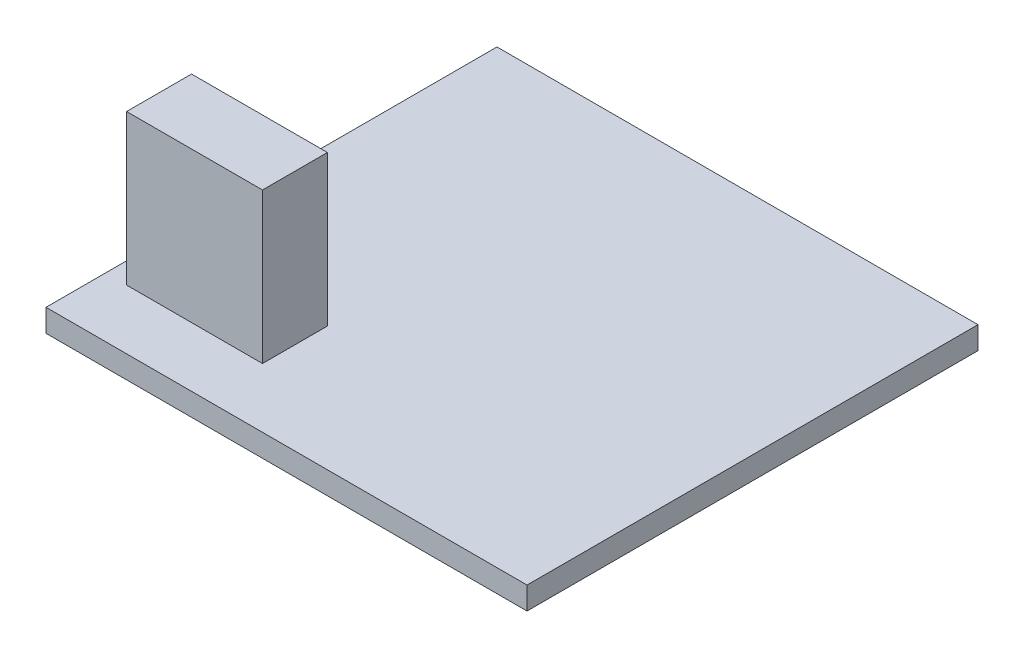
ISO-10303-21;
HEADER;
FILE_DESCRIPTION(('STEP AP214'),'2;1');
FILE_NAME('part.step','',(''),(''),'','','');
FILE_SCHEMA(('AUTOMOTIVE_DESIGN { 1 0 10303 214 1 1 1 1 }'));
ENDSEC;
DATA;
#1=APPLICATION_CONTEXT('core data for automotive mechanical design processes');
#2=APPLICATION_PROTOCOL_DEFINITION('international standard','automotive_design',2000,#1);
#3=PRODUCT_CONTEXT('',#1,'mechanical');
#4=PRODUCT('Part','Part','',(#3));
#5=PRODUCT_RELATED_PRODUCT_CATEGORY('part','',(#4));
#6=PRODUCT_DEFINITION_FORMATION('','',#4);
#7=PRODUCT_DEFINITION_CONTEXT('part definition',#1,'design');
#8=PRODUCT_DEFINITION('design','',#6,#7);
#9=PRODUCT_DEFINITION_SHAPE('','',#8);
#10=(LENGTH_UNIT() NAMED_UNIT(*) SI_UNIT(.MILLI.,.METRE.));
#11=(NAMED_UNIT(*) PLANE_ANGLE_UNIT() SI_UNIT($,.RADIAN.));
#12=(NAMED_UNIT(*) SI_UNIT($,.STERADIAN.) SOLID_ANGLE_UNIT());
#13=UNCERTAINTY_MEASURE_WITH_UNIT(LENGTH_MEASURE(1.E-05),#10,'distance_accuracy_value','');
#14=(GEOMETRIC_REPRESENTATION_CONTEXT(3) GLOBAL_UNCERTAINTY_ASSIGNED_CONTEXT((#13)) GLOBAL_UNIT_ASSIGNED_CONTEXT((#10,
#11,#12)) REPRESENTATION_CONTEXT('',''));
#15=CARTESIAN_POINT('',(0.,0.,0.));
#16=DIRECTION('',(0.,0.,1.));
#17=DIRECTION('',(1.,0.,0.));
#18=AXIS2_PLACEMENT_3D('',#15,#16,#17);
#19=CARTESIAN_POINT('',(0.,1.5,0.));
#20=DIRECTION('',(0.,-1.,0.));
#21=DIRECTION('',(0.,0.,-1.));
#22=AXIS2_PLACEMENT_3D('',#19,#20,#21);
#23=PLANE('',#22);
#24=DIRECTION('',(0.,0.,-1.));
#25=VECTOR('',#24,1.);
#26=CARTESIAN_POINT('',(16.,1.5,15.));
#27=LINE('',#26,#25);
#28=CARTESIAN_POINT('',(16.,1.5,15.));
#29=VERTEX_POINT('',#28);
#30=CARTESIAN_POINT('',(16.,1.5,-15.));
#31=VERTEX_POINT('',#30);
#32=EDGE_CURVE('E138',#29,#31,#27,.T.);
#33=ORIENTED_EDGE('',*,*,#32,.T.);
#34=DIRECTION('',(-1.,0.,0.));
#35=VECTOR('',#34,1.);
#36=CARTESIAN_POINT('',(-16.,1.5,-15.));
#37=LINE('',#36,#35);
#38=CARTESIAN_POINT('',(-16.,1.5,-15.));
#39=VERTEX_POINT('',#38);
#40=EDGE_CURVE('E141',#31,#39,#37,.T.);
#41=ORIENTED_EDGE('',*,*,#40,.T.);
#42=DIRECTION('',(0.,0.,1.));
#43=VECTOR('',#42,1.);
#44=CARTESIAN_POINT('',(-16.,1.5,15.));
#45=LINE('',#44,#43);
#46=CARTESIAN_POINT('',(-16.,1.5,15.));
#47=VERTEX_POINT('',#46);
#48=EDGE_CURVE('E144',#39,#47,#45,.T.);
#49=ORIENTED_EDGE('',*,*,#48,.T.);
#50=DIRECTION('',(1.,0.,0.));
#51=VECTOR('',#50,1.);
#52=CARTESIAN_POINT('',(-16.,1.5,15.));
#53=LINE('',#52,#51);
#54=EDGE_CURVE('E146',#47,#29,#53,.T.);
#55=ORIENTED_EDGE('',*,*,#54,.T.);
#56=EDGE_LOOP('',(#33,#41,#49,#55));
#57=FACE_BOUND('',#56,.T.);
#58=DIRECTION('',(1.,0.,0.));
#59=VECTOR('',#58,1.);
#60=CARTESIAN_POINT('',(-14.5989415767357,1.5,11.0391996580248));
#61=LINE('',#60,#59);
#62=CARTESIAN_POINT('',(-14.5989415767357,1.5,11.0391996580248));
#63=VERTEX_POINT('',#62);
#64=CARTESIAN_POINT('',(-5.55959692922263,1.5,11.0391996580248));
#65=VERTEX_POINT('',#64);
#66=EDGE_CURVE('E116',#63,#65,#61,.T.);
#67=ORIENTED_EDGE('',*,*,#66,.F.);
#68=DIRECTION('',(0.,0.,1.));
#69=VECTOR('',#68,1.);
#70=CARTESIAN_POINT('',(-14.5989415767357,1.5,6.71951283531943));
#71=LINE('',#70,#69);
#72=CARTESIAN_POINT('',(-14.5989415767357,1.5,6.71951283531943));
#73=VERTEX_POINT('',#72);
#74=EDGE_CURVE('E111',#73,#63,#71,.T.);
#75=ORIENTED_EDGE('',*,*,#74,.F.);
#76=DIRECTION('',(1.,0.,0.));
#77=VECTOR('',#76,1.);
#78=CARTESIAN_POINT('',(-14.5989415767357,1.5,6.71951283531943));
#79=LINE('',#78,#77);
#80=CARTESIAN_POINT('',(-5.55959692922263,1.5,6.71951283531943));
#81=VERTEX_POINT('',#80);
#82=EDGE_CURVE('E55',#73,#81,#79,.T.);
#83=ORIENTED_EDGE('',*,*,#82,.T.);
#84=DIRECTION('',(0.,0.,1.));
#85=VECTOR('',#84,1.);
#86=CARTESIAN_POINT('',(-5.55959692922263,1.5,6.71951283531943));
#87=LINE('',#86,#85);
#88=EDGE_CURVE('E50',#81,#65,#87,.T.);
#89=ORIENTED_EDGE('',*,*,#88,.T.);
#90=EDGE_LOOP('',(#67,#75,#83,#89));
#91=FACE_BOUND('',#90,.T.);
#92=ADVANCED_FACE('F35',(#57,#91),#23,.F.);
#93=CARTESIAN_POINT('',(16.,1.5,15.));
#94=DIRECTION('',(-1.,0.,0.));
#95=DIRECTION('',(0.,0.,1.));
#96=AXIS2_PLACEMENT_3D('',#93,#94,#95);
#97=PLANE('',#96);
#98=DIRECTION('',(0.,0.,-1.));
#99=VECTOR('',#98,1.);
#100=CARTESIAN_POINT('',(16.,0.,15.));
#101=LINE('',#100,#99);
#102=CARTESIAN_POINT('',(16.,0.,15.));
#103=VERTEX_POINT('',#102);
#104=CARTESIAN_POINT('',(16.,0.,-15.));
#105=VERTEX_POINT('',#104);
#106=EDGE_CURVE('E118',#103,#105,#101,.T.);
#107=ORIENTED_EDGE('',*,*,#106,.T.);
#108=DIRECTION('',(0.,-1.,0.));
#109=VECTOR('',#108,1.);
#110=CARTESIAN_POINT('',(16.,1.5,-15.));
#111=LINE('',#110,#109);
#112=EDGE_CURVE('E11',#31,#105,#111,.T.);
#113=ORIENTED_EDGE('',*,*,#112,.F.);
#114=ORIENTED_EDGE('',*,*,#32,.F.);
#115=DIRECTION('',(0.,-1.,0.));
#116=VECTOR('',#115,1.);
#117=CARTESIAN_POINT('',(16.,1.5,15.));
#118=LINE('',#117,#116);
#119=EDGE_CURVE('E148',#29,#103,#118,.T.);
#120=ORIENTED_EDGE('',*,*,#119,.T.);
#121=EDGE_LOOP('',(#107,#113,#114,#120));
#122=FACE_BOUND('',#121,.T.);
#123=ADVANCED_FACE('F37',(#122),#97,.F.);
#124=CARTESIAN_POINT('',(-16.,1.5,-15.));
#125=DIRECTION('',(0.,0.,1.));
#126=DIRECTION('',(1.,0.,0.));
#127=AXIS2_PLACEMENT_3D('',#124,#125,#126);
#128=PLANE('',#127);
#129=DIRECTION('',(-1.,0.,0.));
#130=VECTOR('',#129,1.);
#131=CARTESIAN_POINT('',(-16.,0.,-15.));
#132=LINE('',#131,#130);
#133=CARTESIAN_POINT('',(-16.,0.,-15.));
#134=VERTEX_POINT('',#133);
#135=EDGE_CURVE('E151',#105,#134,#132,.T.);
#136=ORIENTED_EDGE('',*,*,#135,.T.);
#137=DIRECTION('',(0.,-1.,0.));
#138=VECTOR('',#137,1.);
#139=CARTESIAN_POINT('',(-16.,1.5,-15.));
#140=LINE('',#139,#138);
#141=EDGE_CURVE('E43',#39,#134,#140,.T.);
#142=ORIENTED_EDGE('',*,*,#141,.F.);
#143=ORIENTED_EDGE('',*,*,#40,.F.);
#144=ORIENTED_EDGE('',*,*,#112,.T.);
#145=EDGE_LOOP('',(#136,#142,#143,#144));
#146=FACE_BOUND('',#145,.T.);
#147=ADVANCED_FACE('F180',(#146),#128,.F.);
#148=CARTESIAN_POINT('',(-16.,1.5,15.));
#149=DIRECTION('',(1.,0.,0.));
#150=DIRECTION('',(0.,0.,-1.));
#151=AXIS2_PLACEMENT_3D('',#148,#149,#150);
#152=PLANE('',#151);
#153=DIRECTION('',(0.,0.,1.));
#154=VECTOR('',#153,1.);
#155=CARTESIAN_POINT('',(-16.,0.,15.));
#156=LINE('',#155,#154);
#157=CARTESIAN_POINT('',(-16.,0.,15.));
#158=VERTEX_POINT('',#157);
#159=EDGE_CURVE('E153',#134,#158,#156,.T.);
#160=ORIENTED_EDGE('',*,*,#159,.T.);
#161=DIRECTION('',(0.,-1.,0.));
#162=VECTOR('',#161,1.);
#163=CARTESIAN_POINT('',(-16.,1.5,15.));
#164=LINE('',#163,#162);
#165=EDGE_CURVE('E158',#47,#158,#164,.T.);
#166=ORIENTED_EDGE('',*,*,#165,.F.);
#167=ORIENTED_EDGE('',*,*,#48,.F.);
#168=ORIENTED_EDGE('',*,*,#141,.T.);
#169=EDGE_LOOP('',(#160,#166,#167,#168));
#170=FACE_BOUND('',#169,.T.);
#171=ADVANCED_FACE('F165',(#170),#152,.F.);
#172=CARTESIAN_POINT('',(-16.,1.5,15.));
#173=DIRECTION('',(0.,0.,-1.));
#174=DIRECTION('',(-1.,0.,0.));
#175=AXIS2_PLACEMENT_3D('',#172,#173,#174);
#176=PLANE('',#175);
#177=DIRECTION('',(1.,0.,0.));
#178=VECTOR('',#177,1.);
#179=CARTESIAN_POINT('',(-16.,0.,15.));
#180=LINE('',#179,#178);
#181=EDGE_CURVE('E142',#158,#103,#180,.T.);
#182=ORIENTED_EDGE('',*,*,#181,.T.);
#183=ORIENTED_EDGE('',*,*,#119,.F.);
#184=ORIENTED_EDGE('',*,*,#54,.F.);
#185=ORIENTED_EDGE('',*,*,#165,.T.);
#186=EDGE_LOOP('',(#182,#183,#184,#185));
#187=FACE_BOUND('',#186,.T.);
#188=ADVANCED_FACE('F174',(#187),#176,.F.);
#189=CARTESIAN_POINT('',(0.,0.,0.));
#190=DIRECTION('',(0.,-1.,0.));
#191=DIRECTION('',(0.,0.,-1.));
#192=AXIS2_PLACEMENT_3D('',#189,#190,#191);
#193=PLANE('',#192);
#194=ORIENTED_EDGE('',*,*,#106,.F.);
#195=ORIENTED_EDGE('',*,*,#181,.F.);
#196=ORIENTED_EDGE('',*,*,#159,.F.);
#197=ORIENTED_EDGE('',*,*,#135,.F.);
#198=EDGE_LOOP('',(#194,#195,#196,#197));
#199=FACE_BOUND('',#198,.T.);
#200=ADVANCED_FACE('F171',(#199),#193,.T.);
#201=CARTESIAN_POINT('',(-14.5989415767357,11.5,11.0391996580248));
#202=DIRECTION('',(0.,0.,-1.));
#203=DIRECTION('',(-1.,0.,0.));
#204=AXIS2_PLACEMENT_3D('',#201,#202,#203);
#205=PLANE('',#204);
#206=ORIENTED_EDGE('',*,*,#66,.T.);
#207=DIRECTION('',(0.,-1.,0.));
#208=VECTOR('',#207,1.);
#209=CARTESIAN_POINT('',(-5.55959692922263,11.5,11.0391996580248));
#210=LINE('',#209,#208);
#211=CARTESIAN_POINT('',(-5.55959692922263,11.5,11.0391996580248));
#212=VERTEX_POINT('',#211);
#213=EDGE_CURVE('E114',#212,#65,#210,.T.);
#214=ORIENTED_EDGE('',*,*,#213,.F.);
#215=DIRECTION('',(1.,0.,0.));
#216=VECTOR('',#215,1.);
#217=CARTESIAN_POINT('',(-14.5989415767357,11.5,11.0391996580248));
#218=LINE('',#217,#216);
#219=CARTESIAN_POINT('',(-14.5989415767357,11.5,11.0391996580248));
#220=VERTEX_POINT('',#219);
#221=EDGE_CURVE('E99',#220,#212,#218,.T.);
#222=ORIENTED_EDGE('',*,*,#221,.F.);
#223=DIRECTION('',(0.,-1.,0.));
#224=VECTOR('',#223,1.);
#225=CARTESIAN_POINT('',(-14.5989415767357,11.5,11.0391996580248));
#226=LINE('',#225,#224);
#227=EDGE_CURVE('E127',#220,#63,#226,.T.);
#228=ORIENTED_EDGE('',*,*,#227,.T.);
#229=EDGE_LOOP('',(#206,#214,#222,#228));
#230=FACE_BOUND('',#229,.T.);
#231=ADVANCED_FACE('F115',(#230),#205,.F.);
#232=CARTESIAN_POINT('',(-5.55959692922263,11.5,6.71951283531943));
#233=DIRECTION('',(1.,0.,0.));
#234=DIRECTION('',(0.,0.,-1.));
#235=AXIS2_PLACEMENT_3D('',#232,#233,#234);
#236=PLANE('',#235);
#237=ORIENTED_EDGE('',*,*,#88,.F.);
#238=DIRECTION('',(0.,-1.,0.));
#239=VECTOR('',#238,1.);
#240=CARTESIAN_POINT('',(-5.55959692922263,11.5,6.71951283531943));
#241=LINE('',#240,#239);
#242=CARTESIAN_POINT('',(-5.55959692922263,11.5,6.71951283531943));
#243=VERTEX_POINT('',#242);
#244=EDGE_CURVE('E119',#243,#81,#241,.T.);
#245=ORIENTED_EDGE('',*,*,#244,.F.);
#246=DIRECTION('',(0.,0.,1.));
#247=VECTOR('',#246,1.);
#248=CARTESIAN_POINT('',(-5.55959692922263,11.5,6.71951283531943));
#249=LINE('',#248,#247);
#250=EDGE_CURVE('E104',#243,#212,#249,.T.);
#251=ORIENTED_EDGE('',*,*,#250,.T.);
#252=ORIENTED_EDGE('',*,*,#213,.T.);
#253=EDGE_LOOP('',(#237,#245,#251,#252));
#254=FACE_BOUND('',#253,.T.);
#255=ADVANCED_FACE('F121',(#254),#236,.T.);
#256=CARTESIAN_POINT('',(-14.5989415767357,11.5,6.71951283531943));
#257=DIRECTION('',(0.,0.,-1.));
#258=DIRECTION('',(-1.,0.,0.));
#259=AXIS2_PLACEMENT_3D('',#256,#257,#258);
#260=PLANE('',#259);
#261=ORIENTED_EDGE('',*,*,#82,.F.);
#262=DIRECTION('',(0.,-1.,0.));
#263=VECTOR('',#262,1.);
#264=CARTESIAN_POINT('',(-14.5989415767357,11.5,6.71951283531943));
#265=LINE('',#264,#263);
#266=CARTESIAN_POINT('',(-14.5989415767357,11.5,6.71951283531943));
#267=VERTEX_POINT('',#266);
#268=EDGE_CURVE('E134',#267,#73,#265,.T.);
#269=ORIENTED_EDGE('',*,*,#268,.F.);
#270=DIRECTION('',(1.,0.,0.));
#271=VECTOR('',#270,1.);
#272=CARTESIAN_POINT('',(-14.5989415767357,11.5,6.71951283531943));
#273=LINE('',#272,#271);
#274=EDGE_CURVE('E122',#267,#243,#273,.T.);
#275=ORIENTED_EDGE('',*,*,#274,.T.);
#276=ORIENTED_EDGE('',*,*,#244,.T.);
#277=EDGE_LOOP('',(#261,#269,#275,#276));
#278=FACE_BOUND('',#277,.T.);
#279=ADVANCED_FACE('F216',(#278),#260,.T.);
#280=CARTESIAN_POINT('',(-14.5989415767357,11.5,6.71951283531943));
#281=DIRECTION('',(1.,0.,0.));
#282=DIRECTION('',(0.,0.,-1.));
#283=AXIS2_PLACEMENT_3D('',#280,#281,#282);
#284=PLANE('',#283);
#285=ORIENTED_EDGE('',*,*,#74,.T.);
#286=ORIENTED_EDGE('',*,*,#227,.F.);
#287=DIRECTION('',(0.,0.,1.));
#288=VECTOR('',#287,1.);
#289=CARTESIAN_POINT('',(-14.5989415767357,11.5,6.71951283531943));
#290=LINE('',#289,#288);
#291=EDGE_CURVE('E107',#267,#220,#290,.T.);
#292=ORIENTED_EDGE('',*,*,#291,.F.);
#293=ORIENTED_EDGE('',*,*,#268,.T.);
#294=EDGE_LOOP('',(#285,#286,#292,#293));
#295=FACE_BOUND('',#294,.T.);
#296=ADVANCED_FACE('F222',(#295),#284,.F.);
#297=CARTESIAN_POINT('',(0.,11.5,0.));
#298=DIRECTION('',(0.,-1.,0.));
#299=DIRECTION('',(0.,0.,-1.));
#300=AXIS2_PLACEMENT_3D('',#297,#298,#299);
#301=PLANE('',#300);
#302=ORIENTED_EDGE('',*,*,#221,.T.);
#303=ORIENTED_EDGE('',*,*,#250,.F.);
#304=ORIENTED_EDGE('',*,*,#274,.F.);
#305=ORIENTED_EDGE('',*,*,#291,.T.);
#306=EDGE_LOOP('',(#302,#303,#304,#305));
#307=FACE_BOUND('',#306,.T.);
#308=ADVANCED_FACE('F101',(#307),#301,.F.);
#309=CLOSED_SHELL('',(#92,#123,#147,#171,#188,#200,#231,#255,#279,#296,#308));
#310=MANIFOLD_SOLID_BREP('B2',#309);
#311=ADVANCED_BREP_SHAPE_REPRESENTATION('',(#18,#310),#14);
#312=SHAPE_DEFINITION_REPRESENTATION(#9,#311);
ENDSEC;
END-ISO-10303-21;
